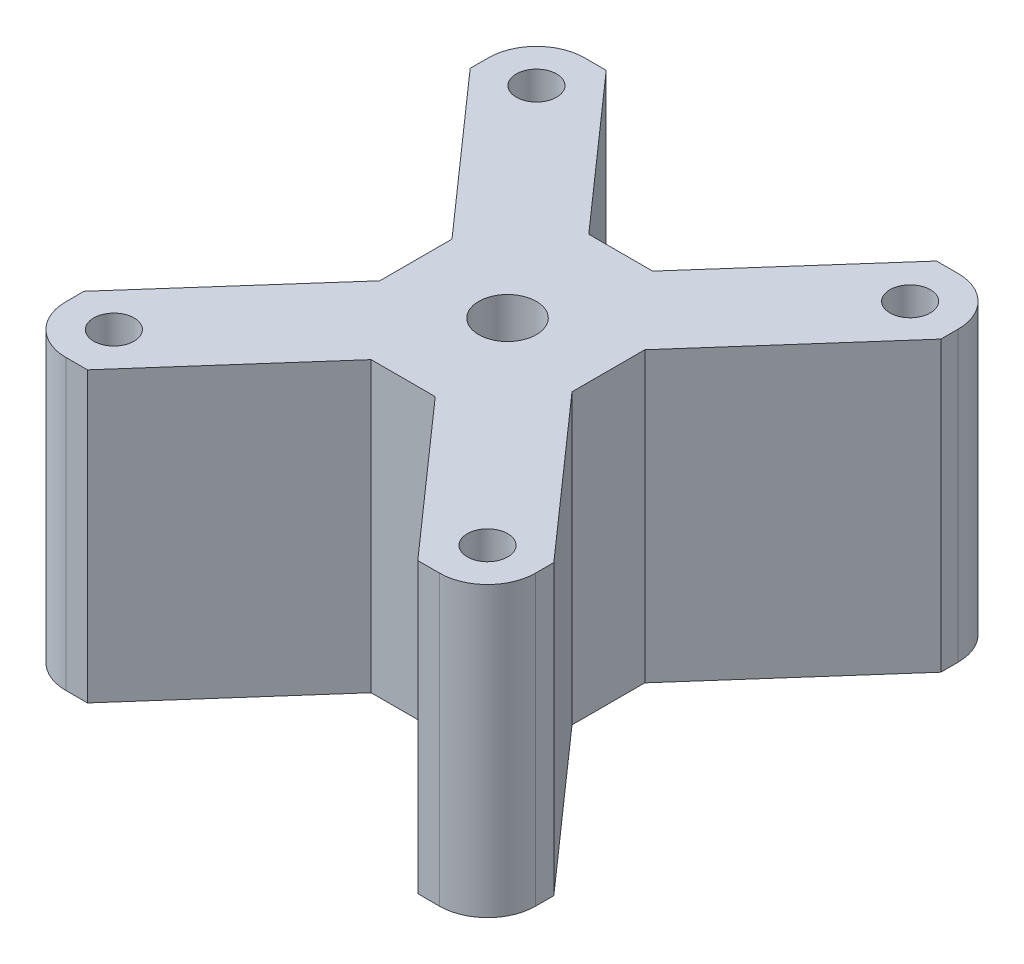
ISO-10303-21;
HEADER;
FILE_DESCRIPTION(('STEP AP214'),'2;1');
FILE_NAME('part.step','',(''),(''),'','','');
FILE_SCHEMA(('AUTOMOTIVE_DESIGN { 1 0 10303 214 1 1 1 1 }'));
ENDSEC;
DATA;
#1=APPLICATION_CONTEXT('core data for automotive mechanical design processes');
#2=APPLICATION_PROTOCOL_DEFINITION('international standard','automotive_design',2000,#1);
#3=PRODUCT_CONTEXT('',#1,'mechanical');
#4=PRODUCT('Part','Part','',(#3));
#5=PRODUCT_RELATED_PRODUCT_CATEGORY('part','',(#4));
#6=PRODUCT_DEFINITION_FORMATION('','',#4);
#7=PRODUCT_DEFINITION_CONTEXT('part definition',#1,'design');
#8=PRODUCT_DEFINITION('design','',#6,#7);
#9=PRODUCT_DEFINITION_SHAPE('','',#8);
#10=(LENGTH_UNIT() NAMED_UNIT(*) SI_UNIT(.MILLI.,.METRE.));
#11=(NAMED_UNIT(*) PLANE_ANGLE_UNIT() SI_UNIT($,.RADIAN.));
#12=(NAMED_UNIT(*) SI_UNIT($,.STERADIAN.) SOLID_ANGLE_UNIT());
#13=UNCERTAINTY_MEASURE_WITH_UNIT(LENGTH_MEASURE(1.E-05),#10,'distance_accuracy_value','');
#14=(GEOMETRIC_REPRESENTATION_CONTEXT(3) GLOBAL_UNCERTAINTY_ASSIGNED_CONTEXT((#13)) GLOBAL_UNIT_ASSIGNED_CONTEXT((#10,
#11,#12)) REPRESENTATION_CONTEXT('',''));
#15=CARTESIAN_POINT('',(0.,0.,0.));
#16=DIRECTION('',(0.,0.,1.));
#17=DIRECTION('',(1.,0.,0.));
#18=AXIS2_PLACEMENT_3D('',#15,#16,#17);
#19=CARTESIAN_POINT('',(9.71399999999135,15.,-11.2189999999902));
#20=DIRECTION('',(0.,1.,0.));
#21=DIRECTION('',(0.,0.,1.));
#22=AXIS2_PLACEMENT_3D('',#19,#20,#21);
#23=PLANE('',#22);
#24=CARTESIAN_POINT('',(-9.71400000000001,15.,-11.2189999999902));
#25=DIRECTION('',(0.,1.,0.));
#26=DIRECTION('',(0.,0.,1.));
#27=AXIS2_PLACEMENT_3D('',#24,#25,#26);
#28=CIRCLE('',#27,1.05000000000286);
#29=CARTESIAN_POINT('',(-9.71400000000001,15.,-10.1689999999874));
#30=VERTEX_POINT('',#29);
#31=EDGE_CURVE('E911',#30,#30,#28,.T.);
#32=ORIENTED_EDGE('',*,*,#31,.F.);
#33=EDGE_LOOP('',(#32));
#34=FACE_BOUND('',#33,.T.);
#35=CARTESIAN_POINT('',(9.71399999999136,15.,10.753));
#36=DIRECTION('',(0.,1.,0.));
#37=DIRECTION('',(0.,0.,1.));
#38=AXIS2_PLACEMENT_3D('',#35,#36,#37);
#39=CIRCLE('',#38,1.05000000000826);
#40=CARTESIAN_POINT('',(9.71399999999136,15.,11.8030000000083));
#41=VERTEX_POINT('',#40);
#42=EDGE_CURVE('E927',#41,#41,#39,.T.);
#43=ORIENTED_EDGE('',*,*,#42,.F.);
#44=EDGE_LOOP('',(#43));
#45=FACE_BOUND('',#44,.T.);
#46=DIRECTION('',(0.,0.,-1.));
#47=VECTOR('',#46,1.);
#48=CARTESIAN_POINT('',(12.2139999999914,15.,-10.3175301047436));
#49=LINE('',#48,#47);
#50=CARTESIAN_POINT('',(12.2139999999914,15.,-10.3175301047436));
#51=VERTEX_POINT('',#50);
#52=CARTESIAN_POINT('',(12.2139999999914,15.,-11.2189999999902));
#53=VERTEX_POINT('',#52);
#54=EDGE_CURVE('E695',#51,#53,#49,.T.);
#55=ORIENTED_EDGE('',*,*,#54,.T.);
#56=CARTESIAN_POINT('',(9.71399999999135,15.,-11.2189999999902));
#57=DIRECTION('',(0.,1.,0.));
#58=DIRECTION('',(0.,0.,1.));
#59=AXIS2_PLACEMENT_3D('',#56,#57,#58);
#60=CIRCLE('',#59,2.5);
#61=CARTESIAN_POINT('',(9.71399999999135,15.,-13.7189999999902));
#62=VERTEX_POINT('',#61);
#63=EDGE_CURVE('E519',#53,#62,#60,.T.);
#64=ORIENTED_EDGE('',*,*,#63,.T.);
#65=DIRECTION('',(1.,0.,0.));
#66=VECTOR('',#65,1.);
#67=CARTESIAN_POINT('',(8.58740267237636,15.,-13.7189999999902));
#68=LINE('',#67,#66);
#69=CARTESIAN_POINT('',(8.58740267237636,15.,-13.7189999999902));
#70=VERTEX_POINT('',#69);
#71=EDGE_CURVE('E768',#70,#62,#68,.T.);
#72=ORIENTED_EDGE('',*,*,#71,.F.);
#73=DIRECTION('',(0.662406133013744,0.,-0.749144922525527));
#74=VECTOR('',#73,1.);
#75=CARTESIAN_POINT('',(1.66039255022599,15.,-5.88493234472561));
#76=LINE('',#75,#74);
#77=CARTESIAN_POINT('',(1.66039255022599,15.,-5.88493234472561));
#78=VERTEX_POINT('',#77);
#79=EDGE_CURVE('E781',#78,#70,#76,.T.);
#80=ORIENTED_EDGE('',*,*,#79,.F.);
#81=DIRECTION('',(1.,0.,0.));
#82=VECTOR('',#81,1.);
#83=CARTESIAN_POINT('',(-1.66039255048656,15.,-5.88493234472561));
#84=LINE('',#83,#82);
#85=CARTESIAN_POINT('',(-1.66039255048656,15.,-5.88493234472561));
#86=VERTEX_POINT('',#85);
#87=EDGE_CURVE('E788',#86,#78,#84,.T.);
#88=ORIENTED_EDGE('',*,*,#87,.F.);
#89=DIRECTION('',(0.662406133020814,0.,0.749144922519276));
#90=VECTOR('',#89,1.);
#91=CARTESIAN_POINT('',(-8.58740267276866,15.,-13.7189999999902));
#92=LINE('',#91,#90);
#93=CARTESIAN_POINT('',(-8.58740267276866,15.,-13.7189999999902));
#94=VERTEX_POINT('',#93);
#95=EDGE_CURVE('E795',#94,#86,#92,.T.);
#96=ORIENTED_EDGE('',*,*,#95,.F.);
#97=DIRECTION('',(1.,0.,0.));
#98=VECTOR('',#97,1.);
#99=CARTESIAN_POINT('',(-9.714,15.,-13.7189999999902));
#100=LINE('',#99,#98);
#101=CARTESIAN_POINT('',(-9.714,15.,-13.7189999999902));
#102=VERTEX_POINT('',#101);
#103=EDGE_CURVE('E799',#102,#94,#100,.T.);
#104=ORIENTED_EDGE('',*,*,#103,.F.);
#105=CARTESIAN_POINT('',(-9.71400000000001,15.,-11.2189999999902));
#106=DIRECTION('',(0.,-1.,0.));
#107=DIRECTION('',(0.,0.,-1.));
#108=AXIS2_PLACEMENT_3D('',#105,#106,#107);
#109=CIRCLE('',#108,2.5);
#110=CARTESIAN_POINT('',(-12.214,15.,-11.2189999999902));
#111=VERTEX_POINT('',#110);
#112=EDGE_CURVE('E803',#111,#102,#109,.T.);
#113=ORIENTED_EDGE('',*,*,#112,.F.);
#114=DIRECTION('',(0.,0.,-1.));
#115=VECTOR('',#114,1.);
#116=CARTESIAN_POINT('',(-12.214,15.,-10.2722429239179));
#117=LINE('',#116,#115);
#118=CARTESIAN_POINT('',(-12.214,15.,-10.2722429239179));
#119=VERTEX_POINT('',#118);
#120=EDGE_CURVE('E807',#119,#111,#117,.T.);
#121=ORIENTED_EDGE('',*,*,#120,.F.);
#122=DIRECTION('',(-0.662406133019342,0.,-0.749144922520578));
#123=VECTOR('',#122,1.);
#124=CARTESIAN_POINT('',(-4.99753056588017,15.,-2.11081269914983));
#125=LINE('',#124,#123);
#126=CARTESIAN_POINT('',(-4.99753056588017,15.,-2.11081269914983));
#127=VERTEX_POINT('',#126);
#128=EDGE_CURVE('E811',#127,#119,#125,.T.);
#129=ORIENTED_EDGE('',*,*,#128,.F.);
#130=DIRECTION('',(0.,0.,1.));
#131=VECTOR('',#130,1.);
#132=CARTESIAN_POINT('',(-4.99753056588017,15.,-2.11081269914983));
#133=LINE('',#132,#131);
#134=CARTESIAN_POINT('',(-4.99753056588017,15.,1.64481269900391));
#135=VERTEX_POINT('',#134);
#136=EDGE_CURVE('E815',#127,#135,#133,.T.);
#137=ORIENTED_EDGE('',*,*,#136,.T.);
#138=DIRECTION('',(-0.662406133013744,0.,0.749144922525527));
#139=VECTOR('',#138,1.);
#140=CARTESIAN_POINT('',(-4.99753056588017,15.,1.64481269900391));
#141=LINE('',#140,#139);
#142=CARTESIAN_POINT('',(-12.214,15.,9.8062429238949));
#143=VERTEX_POINT('',#142);
#144=EDGE_CURVE('E818',#135,#143,#141,.T.);
#145=ORIENTED_EDGE('',*,*,#144,.T.);
#146=DIRECTION('',(0.,0.,-1.));
#147=VECTOR('',#146,1.);
#148=CARTESIAN_POINT('',(-12.214,15.,10.753));
#149=LINE('',#148,#147);
#150=CARTESIAN_POINT('',(-12.214,15.,10.753));
#151=VERTEX_POINT('',#150);
#152=EDGE_CURVE('E821',#151,#143,#149,.T.);
#153=ORIENTED_EDGE('',*,*,#152,.F.);
#154=CARTESIAN_POINT('',(-9.714,15.,10.753));
#155=DIRECTION('',(0.,-1.,0.));
#156=DIRECTION('',(0.,0.,-1.));
#157=AXIS2_PLACEMENT_3D('',#154,#155,#156);
#158=CIRCLE('',#157,2.5);
#159=CARTESIAN_POINT('',(-9.714,15.,13.253));
#160=VERTEX_POINT('',#159);
#161=EDGE_CURVE('E825',#160,#151,#158,.T.);
#162=ORIENTED_EDGE('',*,*,#161,.F.);
#163=DIRECTION('',(1.,0.,0.));
#164=VECTOR('',#163,1.);
#165=CARTESIAN_POINT('',(-9.714,15.,13.253));
#166=LINE('',#165,#164);
#167=CARTESIAN_POINT('',(-8.5859138969199,15.,13.253));
#168=VERTEX_POINT('',#167);
#169=EDGE_CURVE('E829',#160,#168,#166,.T.);
#170=ORIENTED_EDGE('',*,*,#169,.T.);
#171=DIRECTION('',(0.661664335640827,0.,-0.749800178008103));
#172=VECTOR('',#171,1.);
#173=CARTESIAN_POINT('',(-8.5859138969199,15.,13.253));
#174=LINE('',#173,#172);
#175=CARTESIAN_POINT('',(-1.6727077887854,15.,5.4189323447354));
#176=VERTEX_POINT('',#175);
#177=EDGE_CURVE('E832',#168,#176,#174,.T.);
#178=ORIENTED_EDGE('',*,*,#177,.T.);
#179=DIRECTION('',(1.,0.,0.));
#180=VECTOR('',#179,1.);
#181=CARTESIAN_POINT('',(-1.6727077887854,15.,5.4189323447354));
#182=LINE('',#181,#180);
#183=CARTESIAN_POINT('',(1.66039255046393,15.,5.4189323447354));
#184=VERTEX_POINT('',#183);
#185=EDGE_CURVE('E835',#176,#184,#182,.T.);
#186=ORIENTED_EDGE('',*,*,#185,.T.);
#187=DIRECTION('',(0.662406133019342,0.,0.749144922520577));
#188=VECTOR('',#187,1.);
#189=CARTESIAN_POINT('',(1.66039255046393,15.,5.4189323447354));
#190=LINE('',#189,#188);
#191=CARTESIAN_POINT('',(8.5874026727186,15.,13.253));
#192=VERTEX_POINT('',#191);
#193=EDGE_CURVE('E838',#184,#192,#190,.T.);
#194=ORIENTED_EDGE('',*,*,#193,.T.);
#195=DIRECTION('',(1.,0.,0.));
#196=VECTOR('',#195,1.);
#197=CARTESIAN_POINT('',(8.5874026727186,15.,13.253));
#198=LINE('',#197,#196);
#199=CARTESIAN_POINT('',(9.71399999999136,15.,13.253));
#200=VERTEX_POINT('',#199);
#201=EDGE_CURVE('E841',#192,#200,#198,.T.);
#202=ORIENTED_EDGE('',*,*,#201,.T.);
#203=CARTESIAN_POINT('',(9.71399999999136,15.,10.753));
#204=DIRECTION('',(0.,1.,0.));
#205=DIRECTION('',(0.,0.,1.));
#206=AXIS2_PLACEMENT_3D('',#203,#204,#205);
#207=CIRCLE('',#206,2.5);
#208=CARTESIAN_POINT('',(12.2139999999914,15.,10.753));
#209=VERTEX_POINT('',#208);
#210=EDGE_CURVE('E844',#200,#209,#207,.T.);
#211=ORIENTED_EDGE('',*,*,#210,.T.);
#212=DIRECTION('',(0.,0.,-1.));
#213=VECTOR('',#212,1.);
#214=CARTESIAN_POINT('',(12.2139999999914,15.,10.753));
#215=LINE('',#214,#213);
#216=CARTESIAN_POINT('',(12.2139999999914,15.,9.80624292388141));
#217=VERTEX_POINT('',#216);
#218=EDGE_CURVE('E598',#209,#217,#215,.T.);
#219=ORIENTED_EDGE('',*,*,#218,.T.);
#220=DIRECTION('',(0.662406133020814,0.,0.749144922519276));
#221=VECTOR('',#220,1.);
#222=CARTESIAN_POINT('',(4.99753056587153,15.,1.64481269914562));
#223=LINE('',#222,#221);
#224=CARTESIAN_POINT('',(4.99753056587153,15.,1.64481269914562));
#225=VERTEX_POINT('',#224);
#226=EDGE_CURVE('E585',#225,#217,#223,.T.);
#227=ORIENTED_EDGE('',*,*,#226,.F.);
#228=DIRECTION('',(0.,0.,1.));
#229=VECTOR('',#228,1.);
#230=CARTESIAN_POINT('',(4.99753056587153,15.,-2.13980346174328));
#231=LINE('',#230,#229);
#232=CARTESIAN_POINT('',(4.99753056587153,15.,-2.13980346174328));
#233=VERTEX_POINT('',#232);
#234=EDGE_CURVE('E596',#233,#225,#231,.T.);
#235=ORIENTED_EDGE('',*,*,#234,.F.);
#236=DIRECTION('',(0.661664335640827,0.,-0.749800178008103));
#237=VECTOR('',#236,1.);
#238=CARTESIAN_POINT('',(4.99753056587153,15.,-2.13980346174328));
#239=LINE('',#238,#237);
#240=EDGE_CURVE('E432',#233,#51,#239,.T.);
#241=ORIENTED_EDGE('',*,*,#240,.T.);
#242=EDGE_LOOP('',(#55,#64,#72,#80,#88,#96,#104,#113,#121,#129,#137,#145,#153,#162,#170,#178,
#186,#194,#202,#211,#219,#227,#235,#241));
#243=FACE_BOUND('',#242,.T.);
#244=CARTESIAN_POINT('',(9.71399999999135,15.,-11.2189999999902));
#245=DIRECTION('',(0.,1.,0.));
#246=DIRECTION('',(0.,0.,1.));
#247=AXIS2_PLACEMENT_3D('',#244,#245,#246);
#248=CIRCLE('',#247,1.05000000001113);
#249=CARTESIAN_POINT('',(9.71399999999135,15.,-10.1689999999791));
#250=VERTEX_POINT('',#249);
#251=EDGE_CURVE('E615',#250,#250,#248,.T.);
#252=ORIENTED_EDGE('',*,*,#251,.F.);
#253=EDGE_LOOP('',(#252));
#254=FACE_BOUND('',#253,.T.);
#255=CARTESIAN_POINT('',(-9.714,15.,10.753));
#256=DIRECTION('',(0.,1.,0.));
#257=DIRECTION('',(0.,0.,1.));
#258=AXIS2_PLACEMENT_3D('',#255,#256,#257);
#259=CIRCLE('',#258,1.05);
#260=CARTESIAN_POINT('',(-9.714,15.,11.803));
#261=VERTEX_POINT('',#260);
#262=EDGE_CURVE('E919',#261,#261,#259,.T.);
#263=ORIENTED_EDGE('',*,*,#262,.F.);
#264=EDGE_LOOP('',(#263));
#265=FACE_BOUND('',#264,.T.);
#266=CARTESIAN_POINT('',(0.,15.,0.));
#267=DIRECTION('',(0.,1.,0.));
#268=DIRECTION('',(0.,0.,1.));
#269=AXIS2_PLACEMENT_3D('',#266,#267,#268);
#270=CIRCLE('',#269,1.5);
#271=CARTESIAN_POINT('',(0.,15.,1.5));
#272=VERTEX_POINT('',#271);
#273=EDGE_CURVE('E900',#272,#272,#270,.T.);
#274=ORIENTED_EDGE('',*,*,#273,.F.);
#275=EDGE_LOOP('',(#274));
#276=FACE_BOUND('',#275,.T.);
#277=ADVANCED_FACE('F414',(#34,#45,#243,#254,#265,#276),#23,.T.);
#278=CARTESIAN_POINT('',(9.71399999999135,0.,-11.2189999999902));
#279=DIRECTION('',(0.,1.,0.));
#280=DIRECTION('',(0.,0.,1.));
#281=AXIS2_PLACEMENT_3D('',#278,#279,#280);
#282=PLANE('',#281);
#283=DIRECTION('',(0.,0.,-1.));
#284=VECTOR('',#283,1.);
#285=CARTESIAN_POINT('',(12.2139999999914,0.,-10.3175301047436));
#286=LINE('',#285,#284);
#287=CARTESIAN_POINT('',(12.2139999999914,0.,-10.3175301047436));
#288=VERTEX_POINT('',#287);
#289=CARTESIAN_POINT('',(12.2139999999914,0.,-11.2189999999902));
#290=VERTEX_POINT('',#289);
#291=EDGE_CURVE('E610',#288,#290,#286,.T.);
#292=ORIENTED_EDGE('',*,*,#291,.F.);
#293=DIRECTION('',(0.661664335640827,0.,-0.749800178008103));
#294=VECTOR('',#293,1.);
#295=CARTESIAN_POINT('',(4.99753056587153,0.,-2.13980346174328));
#296=LINE('',#295,#294);
#297=CARTESIAN_POINT('',(4.99753056587153,0.,-2.13980346174328));
#298=VERTEX_POINT('',#297);
#299=EDGE_CURVE('E511',#298,#288,#296,.T.);
#300=ORIENTED_EDGE('',*,*,#299,.F.);
#301=DIRECTION('',(0.,0.,1.));
#302=VECTOR('',#301,1.);
#303=CARTESIAN_POINT('',(4.99753056587153,0.,-2.13980346174328));
#304=LINE('',#303,#302);
#305=CARTESIAN_POINT('',(4.99753056587153,0.,1.64481269914562));
#306=VERTEX_POINT('',#305);
#307=EDGE_CURVE('E690',#298,#306,#304,.T.);
#308=ORIENTED_EDGE('',*,*,#307,.T.);
#309=DIRECTION('',(0.662406133020814,0.,0.749144922519276));
#310=VECTOR('',#309,1.);
#311=CARTESIAN_POINT('',(4.99753056587153,0.,1.64481269914562));
#312=LINE('',#311,#310);
#313=CARTESIAN_POINT('',(12.2139999999914,0.,9.80624292388141));
#314=VERTEX_POINT('',#313);
#315=EDGE_CURVE('E587',#306,#314,#312,.T.);
#316=ORIENTED_EDGE('',*,*,#315,.T.);
#317=DIRECTION('',(0.,0.,-1.));
#318=VECTOR('',#317,1.);
#319=CARTESIAN_POINT('',(12.2139999999914,0.,10.753));
#320=LINE('',#319,#318);
#321=CARTESIAN_POINT('',(12.2139999999914,0.,10.753));
#322=VERTEX_POINT('',#321);
#323=EDGE_CURVE('E684',#322,#314,#320,.T.);
#324=ORIENTED_EDGE('',*,*,#323,.F.);
#325=CARTESIAN_POINT('',(9.71399999999136,0.,10.753));
#326=DIRECTION('',(0.,1.,0.));
#327=DIRECTION('',(0.,0.,1.));
#328=AXIS2_PLACEMENT_3D('',#325,#326,#327);
#329=CIRCLE('',#328,2.5);
#330=CARTESIAN_POINT('',(9.71399999999136,0.,13.253));
#331=VERTEX_POINT('',#330);
#332=EDGE_CURVE('E681',#331,#322,#329,.T.);
#333=ORIENTED_EDGE('',*,*,#332,.F.);
#334=DIRECTION('',(1.,0.,0.));
#335=VECTOR('',#334,1.);
#336=CARTESIAN_POINT('',(8.5874026727186,0.,13.253));
#337=LINE('',#336,#335);
#338=CARTESIAN_POINT('',(8.5874026727186,0.,13.253));
#339=VERTEX_POINT('',#338);
#340=EDGE_CURVE('E678',#339,#331,#337,.T.);
#341=ORIENTED_EDGE('',*,*,#340,.F.);
#342=DIRECTION('',(0.662406133019342,0.,0.749144922520577));
#343=VECTOR('',#342,1.);
#344=CARTESIAN_POINT('',(1.66039255046393,0.,5.4189323447354));
#345=LINE('',#344,#343);
#346=CARTESIAN_POINT('',(1.66039255046393,0.,5.4189323447354));
#347=VERTEX_POINT('',#346);
#348=EDGE_CURVE('E675',#347,#339,#345,.T.);
#349=ORIENTED_EDGE('',*,*,#348,.F.);
#350=DIRECTION('',(1.,0.,0.));
#351=VECTOR('',#350,1.);
#352=CARTESIAN_POINT('',(-1.6727077887854,0.,5.4189323447354));
#353=LINE('',#352,#351);
#354=CARTESIAN_POINT('',(-1.6727077887854,0.,5.4189323447354));
#355=VERTEX_POINT('',#354);
#356=EDGE_CURVE('E672',#355,#347,#353,.T.);
#357=ORIENTED_EDGE('',*,*,#356,.F.);
#358=DIRECTION('',(0.661664335640827,0.,-0.749800178008103));
#359=VECTOR('',#358,1.);
#360=CARTESIAN_POINT('',(-8.5859138969199,0.,13.253));
#361=LINE('',#360,#359);
#362=CARTESIAN_POINT('',(-8.5859138969199,0.,13.253));
#363=VERTEX_POINT('',#362);
#364=EDGE_CURVE('E669',#363,#355,#361,.T.);
#365=ORIENTED_EDGE('',*,*,#364,.F.);
#366=DIRECTION('',(1.,0.,0.));
#367=VECTOR('',#366,1.);
#368=CARTESIAN_POINT('',(-9.714,0.,13.253));
#369=LINE('',#368,#367);
#370=CARTESIAN_POINT('',(-9.714,0.,13.253));
#371=VERTEX_POINT('',#370);
#372=EDGE_CURVE('E666',#371,#363,#369,.T.);
#373=ORIENTED_EDGE('',*,*,#372,.F.);
#374=CARTESIAN_POINT('',(-9.714,0.,10.753));
#375=DIRECTION('',(0.,-1.,0.));
#376=DIRECTION('',(0.,0.,-1.));
#377=AXIS2_PLACEMENT_3D('',#374,#375,#376);
#378=CIRCLE('',#377,2.5);
#379=CARTESIAN_POINT('',(-12.214,0.,10.753));
#380=VERTEX_POINT('',#379);
#381=EDGE_CURVE('E662',#371,#380,#378,.T.);
#382=ORIENTED_EDGE('',*,*,#381,.T.);
#383=DIRECTION('',(0.,0.,-1.));
#384=VECTOR('',#383,1.);
#385=CARTESIAN_POINT('',(-12.214,0.,10.753));
#386=LINE('',#385,#384);
#387=CARTESIAN_POINT('',(-12.214,0.,9.8062429238949));
#388=VERTEX_POINT('',#387);
#389=EDGE_CURVE('E658',#380,#388,#386,.T.);
#390=ORIENTED_EDGE('',*,*,#389,.T.);
#391=DIRECTION('',(-0.662406133013744,0.,0.749144922525527));
#392=VECTOR('',#391,1.);
#393=CARTESIAN_POINT('',(-4.99753056588017,0.,1.64481269900391));
#394=LINE('',#393,#392);
#395=CARTESIAN_POINT('',(-4.99753056588017,0.,1.64481269900391));
#396=VERTEX_POINT('',#395);
#397=EDGE_CURVE('E654',#396,#388,#394,.T.);
#398=ORIENTED_EDGE('',*,*,#397,.F.);
#399=DIRECTION('',(0.,0.,1.));
#400=VECTOR('',#399,1.);
#401=CARTESIAN_POINT('',(-4.99753056588017,0.,-2.11081269914983));
#402=LINE('',#401,#400);
#403=CARTESIAN_POINT('',(-4.99753056588017,0.,-2.11081269914983));
#404=VERTEX_POINT('',#403);
#405=EDGE_CURVE('E651',#404,#396,#402,.T.);
#406=ORIENTED_EDGE('',*,*,#405,.F.);
#407=DIRECTION('',(-0.662406133019342,0.,-0.749144922520578));
#408=VECTOR('',#407,1.);
#409=CARTESIAN_POINT('',(-4.99753056588017,0.,-2.11081269914983));
#410=LINE('',#409,#408);
#411=CARTESIAN_POINT('',(-12.214,0.,-10.2722429239179));
#412=VERTEX_POINT('',#411);
#413=EDGE_CURVE('E647',#404,#412,#410,.T.);
#414=ORIENTED_EDGE('',*,*,#413,.T.);
#415=DIRECTION('',(0.,0.,-1.));
#416=VECTOR('',#415,1.);
#417=CARTESIAN_POINT('',(-12.214,0.,-10.2722429239179));
#418=LINE('',#417,#416);
#419=CARTESIAN_POINT('',(-12.214,0.,-11.2189999999902));
#420=VERTEX_POINT('',#419);
#421=EDGE_CURVE('E643',#412,#420,#418,.T.);
#422=ORIENTED_EDGE('',*,*,#421,.T.);
#423=CARTESIAN_POINT('',(-9.71400000000001,0.,-11.2189999999902));
#424=DIRECTION('',(0.,-1.,0.));
#425=DIRECTION('',(0.,0.,-1.));
#426=AXIS2_PLACEMENT_3D('',#423,#424,#425);
#427=CIRCLE('',#426,2.5);
#428=CARTESIAN_POINT('',(-9.714,0.,-13.7189999999902));
#429=VERTEX_POINT('',#428);
#430=EDGE_CURVE('E639',#420,#429,#427,.T.);
#431=ORIENTED_EDGE('',*,*,#430,.T.);
#432=DIRECTION('',(1.,0.,0.));
#433=VECTOR('',#432,1.);
#434=CARTESIAN_POINT('',(-9.714,0.,-13.7189999999902));
#435=LINE('',#434,#433);
#436=CARTESIAN_POINT('',(-8.58740267276866,0.,-13.7189999999902));
#437=VERTEX_POINT('',#436);
#438=EDGE_CURVE('E635',#429,#437,#435,.T.);
#439=ORIENTED_EDGE('',*,*,#438,.T.);
#440=DIRECTION('',(0.662406133020814,0.,0.749144922519276));
#441=VECTOR('',#440,1.);
#442=CARTESIAN_POINT('',(-8.58740267276866,0.,-13.7189999999902));
#443=LINE('',#442,#441);
#444=CARTESIAN_POINT('',(-1.66039255048656,0.,-5.88493234472561));
#445=VERTEX_POINT('',#444);
#446=EDGE_CURVE('E631',#437,#445,#443,.T.);
#447=ORIENTED_EDGE('',*,*,#446,.T.);
#448=DIRECTION('',(1.,0.,0.));
#449=VECTOR('',#448,1.);
#450=CARTESIAN_POINT('',(-1.66039255048656,0.,-5.88493234472561));
#451=LINE('',#450,#449);
#452=CARTESIAN_POINT('',(1.66039255022599,0.,-5.88493234472561));
#453=VERTEX_POINT('',#452);
#454=EDGE_CURVE('E627',#445,#453,#451,.T.);
#455=ORIENTED_EDGE('',*,*,#454,.T.);
#456=DIRECTION('',(0.662406133013744,0.,-0.749144922525527));
#457=VECTOR('',#456,1.);
#458=CARTESIAN_POINT('',(1.66039255022599,0.,-5.88493234472561));
#459=LINE('',#458,#457);
#460=CARTESIAN_POINT('',(8.58740267237636,0.,-13.7189999999902));
#461=VERTEX_POINT('',#460);
#462=EDGE_CURVE('E623',#453,#461,#459,.T.);
#463=ORIENTED_EDGE('',*,*,#462,.T.);
#464=DIRECTION('',(1.,0.,0.));
#465=VECTOR('',#464,1.);
#466=CARTESIAN_POINT('',(8.58740267237636,0.,-13.7189999999902));
#467=LINE('',#466,#465);
#468=CARTESIAN_POINT('',(9.71399999999135,0.,-13.7189999999902));
#469=VERTEX_POINT('',#468);
#470=EDGE_CURVE('E619',#461,#469,#467,.T.);
#471=ORIENTED_EDGE('',*,*,#470,.T.);
#472=CARTESIAN_POINT('',(9.71399999999135,0.,-11.2189999999902));
#473=DIRECTION('',(0.,1.,0.));
#474=DIRECTION('',(0.,0.,1.));
#475=AXIS2_PLACEMENT_3D('',#472,#473,#474);
#476=CIRCLE('',#475,2.5);
#477=EDGE_CURVE('E614',#290,#469,#476,.T.);
#478=ORIENTED_EDGE('',*,*,#477,.F.);
#479=EDGE_LOOP('',(#292,#300,#308,#316,#324,#333,#341,#349,#357,#365,#373,#382,#390,#398,#406,
#414,#422,#431,#439,#447,#455,#463,#471,#478));
#480=FACE_BOUND('',#479,.T.);
#481=CARTESIAN_POINT('',(9.71399999999135,0.,-11.2189999999902));
#482=DIRECTION('',(0.,1.,0.));
#483=DIRECTION('',(0.,0.,1.));
#484=AXIS2_PLACEMENT_3D('',#481,#482,#483);
#485=CIRCLE('',#484,1.05000000001113);
#486=CARTESIAN_POINT('',(9.71399999999135,0.,-10.1689999999791));
#487=VERTEX_POINT('',#486);
#488=EDGE_CURVE('E931',#487,#487,#485,.T.);
#489=ORIENTED_EDGE('',*,*,#488,.T.);
#490=EDGE_LOOP('',(#489));
#491=FACE_BOUND('',#490,.T.);
#492=CARTESIAN_POINT('',(9.71399999999136,0.,10.753));
#493=DIRECTION('',(0.,1.,0.));
#494=DIRECTION('',(0.,0.,1.));
#495=AXIS2_PLACEMENT_3D('',#492,#493,#494);
#496=CIRCLE('',#495,1.05000000000826);
#497=CARTESIAN_POINT('',(9.71399999999136,0.,11.8030000000083));
#498=VERTEX_POINT('',#497);
#499=EDGE_CURVE('E923',#498,#498,#496,.T.);
#500=ORIENTED_EDGE('',*,*,#499,.T.);
#501=EDGE_LOOP('',(#500));
#502=FACE_BOUND('',#501,.T.);
#503=CARTESIAN_POINT('',(-9.714,0.,10.753));
#504=DIRECTION('',(0.,1.,0.));
#505=DIRECTION('',(0.,0.,1.));
#506=AXIS2_PLACEMENT_3D('',#503,#504,#505);
#507=CIRCLE('',#506,1.05);
#508=CARTESIAN_POINT('',(-9.714,0.,11.803));
#509=VERTEX_POINT('',#508);
#510=EDGE_CURVE('E915',#509,#509,#507,.T.);
#511=ORIENTED_EDGE('',*,*,#510,.T.);
#512=EDGE_LOOP('',(#511));
#513=FACE_BOUND('',#512,.T.);
#514=CARTESIAN_POINT('',(-9.71400000000001,0.,-11.2189999999902));
#515=DIRECTION('',(0.,1.,0.));
#516=DIRECTION('',(0.,0.,1.));
#517=AXIS2_PLACEMENT_3D('',#514,#515,#516);
#518=CIRCLE('',#517,1.05000000000286);
#519=CARTESIAN_POINT('',(-9.71400000000001,0.,-10.1689999999874));
#520=VERTEX_POINT('',#519);
#521=EDGE_CURVE('E908',#520,#520,#518,.T.);
#522=ORIENTED_EDGE('',*,*,#521,.T.);
#523=EDGE_LOOP('',(#522));
#524=FACE_BOUND('',#523,.T.);
#525=CARTESIAN_POINT('',(0.,0.,0.));
#526=DIRECTION('',(0.,1.,0.));
#527=DIRECTION('',(0.,0.,1.));
#528=AXIS2_PLACEMENT_3D('',#525,#526,#527);
#529=CIRCLE('',#528,1.5);
#530=CARTESIAN_POINT('',(0.,0.,1.5));
#531=VERTEX_POINT('',#530);
#532=EDGE_CURVE('E903',#531,#531,#529,.T.);
#533=ORIENTED_EDGE('',*,*,#532,.T.);
#534=EDGE_LOOP('',(#533));
#535=FACE_BOUND('',#534,.T.);
#536=ADVANCED_FACE('F773',(#480,#491,#502,#513,#524,#535),#282,.F.);
#537=CARTESIAN_POINT('',(12.2139999999914,15.,-10.3175301047436));
#538=DIRECTION('',(-1.,0.,0.));
#539=DIRECTION('',(0.,0.,1.));
#540=AXIS2_PLACEMENT_3D('',#537,#538,#539);
#541=PLANE('',#540);
#542=ORIENTED_EDGE('',*,*,#291,.T.);
#543=DIRECTION('',(0.,-1.,0.));
#544=VECTOR('',#543,1.);
#545=CARTESIAN_POINT('',(12.2139999999914,15.,-11.2189999999902));
#546=LINE('',#545,#544);
#547=EDGE_CURVE('E12',#53,#290,#546,.T.);
#548=ORIENTED_EDGE('',*,*,#547,.F.);
#549=ORIENTED_EDGE('',*,*,#54,.F.);
#550=DIRECTION('',(0.,-1.,0.));
#551=VECTOR('',#550,1.);
#552=CARTESIAN_POINT('',(12.2139999999914,15.,-10.3175301047436));
#553=LINE('',#552,#551);
#554=EDGE_CURVE('E606',#51,#288,#553,.T.);
#555=ORIENTED_EDGE('',*,*,#554,.T.);
#556=EDGE_LOOP('',(#542,#548,#549,#555));
#557=FACE_BOUND('',#556,.T.);
#558=ADVANCED_FACE('F416',(#557),#541,.F.);
#559=CARTESIAN_POINT('',(9.71399999999135,15.,-11.2189999999902));
#560=DIRECTION('',(0.,-1.,0.));
#561=DIRECTION('',(0.,0.,-1.));
#562=AXIS2_PLACEMENT_3D('',#559,#560,#561);
#563=CYLINDRICAL_SURFACE('',#562,2.5);
#564=ORIENTED_EDGE('',*,*,#477,.T.);
#565=DIRECTION('',(0.,-1.,0.));
#566=VECTOR('',#565,1.);
#567=CARTESIAN_POINT('',(9.71399999999135,15.,-13.7189999999902));
#568=LINE('',#567,#566);
#569=EDGE_CURVE('E424',#62,#469,#568,.T.);
#570=ORIENTED_EDGE('',*,*,#569,.F.);
#571=ORIENTED_EDGE('',*,*,#63,.F.);
#572=ORIENTED_EDGE('',*,*,#547,.T.);
#573=EDGE_LOOP('',(#564,#570,#571,#572));
#574=FACE_BOUND('',#573,.T.);
#575=ADVANCED_FACE('F769',(#574),#563,.T.);
#576=CARTESIAN_POINT('',(8.58740267237636,15.,-13.7189999999902));
#577=DIRECTION('',(0.,0.,-1.));
#578=DIRECTION('',(-1.,0.,0.));
#579=AXIS2_PLACEMENT_3D('',#576,#577,#578);
#580=PLANE('',#579);
#581=ORIENTED_EDGE('',*,*,#470,.F.);
#582=DIRECTION('',(0.,-1.,0.));
#583=VECTOR('',#582,1.);
#584=CARTESIAN_POINT('',(8.58740267237636,15.,-13.7189999999902));
#585=LINE('',#584,#583);
#586=EDGE_CURVE('E760',#70,#461,#585,.T.);
#587=ORIENTED_EDGE('',*,*,#586,.F.);
#588=ORIENTED_EDGE('',*,*,#71,.T.);
#589=ORIENTED_EDGE('',*,*,#569,.T.);
#590=EDGE_LOOP('',(#581,#587,#588,#589));
#591=FACE_BOUND('',#590,.T.);
#592=ADVANCED_FACE('F766',(#591),#580,.T.);
#593=CARTESIAN_POINT('',(1.66039255022599,15.,-5.88493234472561));
#594=DIRECTION('',(-0.749144922525527,0.,-0.662406133013744));
#595=DIRECTION('',(-0.662406133013744,0.,0.749144922525527));
#596=AXIS2_PLACEMENT_3D('',#593,#594,#595);
#597=PLANE('',#596);
#598=ORIENTED_EDGE('',*,*,#462,.F.);
#599=DIRECTION('',(0.,-1.,0.));
#600=VECTOR('',#599,1.);
#601=CARTESIAN_POINT('',(1.66039255022599,15.,-5.88493234472561));
#602=LINE('',#601,#600);
#603=EDGE_CURVE('E757',#78,#453,#602,.T.);
#604=ORIENTED_EDGE('',*,*,#603,.F.);
#605=ORIENTED_EDGE('',*,*,#79,.T.);
#606=ORIENTED_EDGE('',*,*,#586,.T.);
#607=EDGE_LOOP('',(#598,#604,#605,#606));
#608=FACE_BOUND('',#607,.T.);
#609=ADVANCED_FACE('F778',(#608),#597,.T.);
#610=CARTESIAN_POINT('',(-1.66039255048656,15.,-5.88493234472561));
#611=DIRECTION('',(0.,0.,-1.));
#612=DIRECTION('',(-1.,0.,0.));
#613=AXIS2_PLACEMENT_3D('',#610,#611,#612);
#614=PLANE('',#613);
#615=ORIENTED_EDGE('',*,*,#454,.F.);
#616=DIRECTION('',(0.,-1.,0.));
#617=VECTOR('',#616,1.);
#618=CARTESIAN_POINT('',(-1.66039255048656,15.,-5.88493234472561));
#619=LINE('',#618,#617);
#620=EDGE_CURVE('E754',#86,#445,#619,.T.);
#621=ORIENTED_EDGE('',*,*,#620,.F.);
#622=ORIENTED_EDGE('',*,*,#87,.T.);
#623=ORIENTED_EDGE('',*,*,#603,.T.);
#624=EDGE_LOOP('',(#615,#621,#622,#623));
#625=FACE_BOUND('',#624,.T.);
#626=ADVANCED_FACE('F1147',(#625),#614,.T.);
#627=CARTESIAN_POINT('',(-8.58740267276866,15.,-13.7189999999902));
#628=DIRECTION('',(0.749144922519276,0.,-0.662406133020814));
#629=DIRECTION('',(-0.662406133020814,0.,-0.749144922519276));
#630=AXIS2_PLACEMENT_3D('',#627,#628,#629);
#631=PLANE('',#630);
#632=ORIENTED_EDGE('',*,*,#446,.F.);
#633=DIRECTION('',(0.,-1.,0.));
#634=VECTOR('',#633,1.);
#635=CARTESIAN_POINT('',(-8.58740267276866,15.,-13.7189999999902));
#636=LINE('',#635,#634);
#637=EDGE_CURVE('E751',#94,#437,#636,.T.);
#638=ORIENTED_EDGE('',*,*,#637,.F.);
#639=ORIENTED_EDGE('',*,*,#95,.T.);
#640=ORIENTED_EDGE('',*,*,#620,.T.);
#641=EDGE_LOOP('',(#632,#638,#639,#640));
#642=FACE_BOUND('',#641,.T.);
#643=ADVANCED_FACE('F1137',(#642),#631,.T.);
#644=CARTESIAN_POINT('',(-9.714,15.,-13.7189999999902));
#645=DIRECTION('',(0.,0.,-1.));
#646=DIRECTION('',(-1.,0.,0.));
#647=AXIS2_PLACEMENT_3D('',#644,#645,#646);
#648=PLANE('',#647);
#649=ORIENTED_EDGE('',*,*,#438,.F.);
#650=DIRECTION('',(0.,-1.,0.));
#651=VECTOR('',#650,1.);
#652=CARTESIAN_POINT('',(-9.714,15.,-13.7189999999902));
#653=LINE('',#652,#651);
#654=EDGE_CURVE('E748',#102,#429,#653,.T.);
#655=ORIENTED_EDGE('',*,*,#654,.F.);
#656=ORIENTED_EDGE('',*,*,#103,.T.);
#657=ORIENTED_EDGE('',*,*,#637,.T.);
#658=EDGE_LOOP('',(#649,#655,#656,#657));
#659=FACE_BOUND('',#658,.T.);
#660=ADVANCED_FACE('F1127',(#659),#648,.T.);
#661=CARTESIAN_POINT('',(-9.71400000000001,15.,-11.2189999999902));
#662=DIRECTION('',(0.,-1.,0.));
#663=DIRECTION('',(0.,0.,-1.));
#664=AXIS2_PLACEMENT_3D('',#661,#662,#663);
#665=CYLINDRICAL_SURFACE('',#664,2.5);
#666=ORIENTED_EDGE('',*,*,#430,.F.);
#667=DIRECTION('',(0.,-1.,0.));
#668=VECTOR('',#667,1.);
#669=CARTESIAN_POINT('',(-12.214,15.,-11.2189999999902));
#670=LINE('',#669,#668);
#671=EDGE_CURVE('E745',#111,#420,#670,.T.);
#672=ORIENTED_EDGE('',*,*,#671,.F.);
#673=ORIENTED_EDGE('',*,*,#112,.T.);
#674=ORIENTED_EDGE('',*,*,#654,.T.);
#675=EDGE_LOOP('',(#666,#672,#673,#674));
#676=FACE_BOUND('',#675,.T.);
#677=ADVANCED_FACE('F1117',(#676),#665,.T.);
#678=CARTESIAN_POINT('',(-12.214,15.,-10.2722429239179));
#679=DIRECTION('',(-1.,0.,0.));
#680=DIRECTION('',(0.,0.,1.));
#681=AXIS2_PLACEMENT_3D('',#678,#679,#680);
#682=PLANE('',#681);
#683=ORIENTED_EDGE('',*,*,#421,.F.);
#684=DIRECTION('',(0.,-1.,0.));
#685=VECTOR('',#684,1.);
#686=CARTESIAN_POINT('',(-12.214,15.,-10.2722429239179));
#687=LINE('',#686,#685);
#688=EDGE_CURVE('E742',#119,#412,#687,.T.);
#689=ORIENTED_EDGE('',*,*,#688,.F.);
#690=ORIENTED_EDGE('',*,*,#120,.T.);
#691=ORIENTED_EDGE('',*,*,#671,.T.);
#692=EDGE_LOOP('',(#683,#689,#690,#691));
#693=FACE_BOUND('',#692,.T.);
#694=ADVANCED_FACE('F1107',(#693),#682,.T.);
#695=CARTESIAN_POINT('',(-4.99753056588017,15.,-2.11081269914983));
#696=DIRECTION('',(-0.749144922520578,0.,0.662406133019342));
#697=DIRECTION('',(0.662406133019342,0.,0.749144922520578));
#698=AXIS2_PLACEMENT_3D('',#695,#696,#697);
#699=PLANE('',#698);
#700=ORIENTED_EDGE('',*,*,#413,.F.);
#701=DIRECTION('',(0.,-1.,0.));
#702=VECTOR('',#701,1.);
#703=CARTESIAN_POINT('',(-4.99753056588017,15.,-2.11081269914983));
#704=LINE('',#703,#702);
#705=EDGE_CURVE('E739',#127,#404,#704,.T.);
#706=ORIENTED_EDGE('',*,*,#705,.F.);
#707=ORIENTED_EDGE('',*,*,#128,.T.);
#708=ORIENTED_EDGE('',*,*,#688,.T.);
#709=EDGE_LOOP('',(#700,#706,#707,#708));
#710=FACE_BOUND('',#709,.T.);
#711=ADVANCED_FACE('F1097',(#710),#699,.T.);
#712=CARTESIAN_POINT('',(-4.99753056588017,15.,-2.11081269914983));
#713=DIRECTION('',(1.,0.,0.));
#714=DIRECTION('',(0.,0.,-1.));
#715=AXIS2_PLACEMENT_3D('',#712,#713,#714);
#716=PLANE('',#715);
#717=ORIENTED_EDGE('',*,*,#405,.T.);
#718=DIRECTION('',(0.,-1.,0.));
#719=VECTOR('',#718,1.);
#720=CARTESIAN_POINT('',(-4.99753056588017,15.,1.64481269900391));
#721=LINE('',#720,#719);
#722=EDGE_CURVE('E735',#135,#396,#721,.T.);
#723=ORIENTED_EDGE('',*,*,#722,.F.);
#724=ORIENTED_EDGE('',*,*,#136,.F.);
#725=ORIENTED_EDGE('',*,*,#705,.T.);
#726=EDGE_LOOP('',(#717,#723,#724,#725));
#727=FACE_BOUND('',#726,.T.);
#728=ADVANCED_FACE('F1087',(#727),#716,.F.);
#729=CARTESIAN_POINT('',(-4.99753056588017,15.,1.64481269900391));
#730=DIRECTION('',(0.749144922525527,0.,0.662406133013744));
#731=DIRECTION('',(0.662406133013744,0.,-0.749144922525527));
#732=AXIS2_PLACEMENT_3D('',#729,#730,#731);
#733=PLANE('',#732);
#734=ORIENTED_EDGE('',*,*,#397,.T.);
#735=DIRECTION('',(0.,-1.,0.));
#736=VECTOR('',#735,1.);
#737=CARTESIAN_POINT('',(-12.214,15.,9.8062429238949));
#738=LINE('',#737,#736);
#739=EDGE_CURVE('E732',#143,#388,#738,.T.);
#740=ORIENTED_EDGE('',*,*,#739,.F.);
#741=ORIENTED_EDGE('',*,*,#144,.F.);
#742=ORIENTED_EDGE('',*,*,#722,.T.);
#743=EDGE_LOOP('',(#734,#740,#741,#742));
#744=FACE_BOUND('',#743,.T.);
#745=ADVANCED_FACE('F1077',(#744),#733,.F.);
#746=CARTESIAN_POINT('',(-12.214,15.,10.753));
#747=DIRECTION('',(-1.,0.,0.));
#748=DIRECTION('',(0.,0.,1.));
#749=AXIS2_PLACEMENT_3D('',#746,#747,#748);
#750=PLANE('',#749);
#751=ORIENTED_EDGE('',*,*,#389,.F.);
#752=DIRECTION('',(0.,-1.,0.));
#753=VECTOR('',#752,1.);
#754=CARTESIAN_POINT('',(-12.214,15.,10.753));
#755=LINE('',#754,#753);
#756=EDGE_CURVE('E729',#151,#380,#755,.T.);
#757=ORIENTED_EDGE('',*,*,#756,.F.);
#758=ORIENTED_EDGE('',*,*,#152,.T.);
#759=ORIENTED_EDGE('',*,*,#739,.T.);
#760=EDGE_LOOP('',(#751,#757,#758,#759));
#761=FACE_BOUND('',#760,.T.);
#762=ADVANCED_FACE('F1067',(#761),#750,.T.);
#763=CARTESIAN_POINT('',(-9.714,15.,10.753));
#764=DIRECTION('',(0.,-1.,0.));
#765=DIRECTION('',(0.,0.,-1.));
#766=AXIS2_PLACEMENT_3D('',#763,#764,#765);
#767=CYLINDRICAL_SURFACE('',#766,2.5);
#768=ORIENTED_EDGE('',*,*,#381,.F.);
#769=DIRECTION('',(0.,-1.,0.));
#770=VECTOR('',#769,1.);
#771=CARTESIAN_POINT('',(-9.714,15.,13.253));
#772=LINE('',#771,#770);
#773=EDGE_CURVE('E726',#160,#371,#772,.T.);
#774=ORIENTED_EDGE('',*,*,#773,.F.);
#775=ORIENTED_EDGE('',*,*,#161,.T.);
#776=ORIENTED_EDGE('',*,*,#756,.T.);
#777=EDGE_LOOP('',(#768,#774,#775,#776));
#778=FACE_BOUND('',#777,.T.);
#779=ADVANCED_FACE('F1057',(#778),#767,.T.);
#780=CARTESIAN_POINT('',(-9.714,15.,13.253));
#781=DIRECTION('',(0.,0.,-1.));
#782=DIRECTION('',(-1.,0.,0.));
#783=AXIS2_PLACEMENT_3D('',#780,#781,#782);
#784=PLANE('',#783);
#785=ORIENTED_EDGE('',*,*,#372,.T.);
#786=DIRECTION('',(0.,-1.,0.));
#787=VECTOR('',#786,1.);
#788=CARTESIAN_POINT('',(-8.5859138969199,15.,13.253));
#789=LINE('',#788,#787);
#790=EDGE_CURVE('E722',#168,#363,#789,.T.);
#791=ORIENTED_EDGE('',*,*,#790,.F.);
#792=ORIENTED_EDGE('',*,*,#169,.F.);
#793=ORIENTED_EDGE('',*,*,#773,.T.);
#794=EDGE_LOOP('',(#785,#791,#792,#793));
#795=FACE_BOUND('',#794,.T.);
#796=ADVANCED_FACE('F1047',(#795),#784,.F.);
#797=CARTESIAN_POINT('',(-8.5859138969199,15.,13.253));
#798=DIRECTION('',(-0.749800178008103,0.,-0.661664335640827));
#799=DIRECTION('',(-0.661664335640827,0.,0.749800178008103));
#800=AXIS2_PLACEMENT_3D('',#797,#798,#799);
#801=PLANE('',#800);
#802=ORIENTED_EDGE('',*,*,#364,.T.);
#803=DIRECTION('',(0.,-1.,0.));
#804=VECTOR('',#803,1.);
#805=CARTESIAN_POINT('',(-1.6727077887854,15.,5.4189323447354));
#806=LINE('',#805,#804);
#807=EDGE_CURVE('E718',#176,#355,#806,.T.);
#808=ORIENTED_EDGE('',*,*,#807,.F.);
#809=ORIENTED_EDGE('',*,*,#177,.F.);
#810=ORIENTED_EDGE('',*,*,#790,.T.);
#811=EDGE_LOOP('',(#802,#808,#809,#810));
#812=FACE_BOUND('',#811,.T.);
#813=ADVANCED_FACE('F1037',(#812),#801,.F.);
#814=CARTESIAN_POINT('',(-1.6727077887854,15.,5.4189323447354));
#815=DIRECTION('',(0.,0.,-1.));
#816=DIRECTION('',(-1.,0.,0.));
#817=AXIS2_PLACEMENT_3D('',#814,#815,#816);
#818=PLANE('',#817);
#819=ORIENTED_EDGE('',*,*,#356,.T.);
#820=DIRECTION('',(0.,-1.,0.));
#821=VECTOR('',#820,1.);
#822=CARTESIAN_POINT('',(1.66039255046393,15.,5.4189323447354));
#823=LINE('',#822,#821);
#824=EDGE_CURVE('E714',#184,#347,#823,.T.);
#825=ORIENTED_EDGE('',*,*,#824,.F.);
#826=ORIENTED_EDGE('',*,*,#185,.F.);
#827=ORIENTED_EDGE('',*,*,#807,.T.);
#828=EDGE_LOOP('',(#819,#825,#826,#827));
#829=FACE_BOUND('',#828,.T.);
#830=ADVANCED_FACE('F1027',(#829),#818,.F.);
#831=CARTESIAN_POINT('',(1.66039255046393,15.,5.4189323447354));
#832=DIRECTION('',(0.749144922520577,0.,-0.662406133019342));
#833=DIRECTION('',(-0.662406133019342,0.,-0.749144922520577));
#834=AXIS2_PLACEMENT_3D('',#831,#832,#833);
#835=PLANE('',#834);
#836=ORIENTED_EDGE('',*,*,#348,.T.);
#837=DIRECTION('',(0.,-1.,0.));
#838=VECTOR('',#837,1.);
#839=CARTESIAN_POINT('',(8.5874026727186,15.,13.253));
#840=LINE('',#839,#838);
#841=EDGE_CURVE('E710',#192,#339,#840,.T.);
#842=ORIENTED_EDGE('',*,*,#841,.F.);
#843=ORIENTED_EDGE('',*,*,#193,.F.);
#844=ORIENTED_EDGE('',*,*,#824,.T.);
#845=EDGE_LOOP('',(#836,#842,#843,#844));
#846=FACE_BOUND('',#845,.T.);
#847=ADVANCED_FACE('F1017',(#846),#835,.F.);
#848=CARTESIAN_POINT('',(8.5874026727186,15.,13.253));
#849=DIRECTION('',(0.,0.,-1.));
#850=DIRECTION('',(-1.,0.,0.));
#851=AXIS2_PLACEMENT_3D('',#848,#849,#850);
#852=PLANE('',#851);
#853=ORIENTED_EDGE('',*,*,#340,.T.);
#854=DIRECTION('',(0.,-1.,0.));
#855=VECTOR('',#854,1.);
#856=CARTESIAN_POINT('',(9.71399999999136,15.,13.253));
#857=LINE('',#856,#855);
#858=EDGE_CURVE('E706',#200,#331,#857,.T.);
#859=ORIENTED_EDGE('',*,*,#858,.F.);
#860=ORIENTED_EDGE('',*,*,#201,.F.);
#861=ORIENTED_EDGE('',*,*,#841,.T.);
#862=EDGE_LOOP('',(#853,#859,#860,#861));
#863=FACE_BOUND('',#862,.T.);
#864=ADVANCED_FACE('F1008',(#863),#852,.F.);
#865=CARTESIAN_POINT('',(9.71399999999136,15.,10.753));
#866=DIRECTION('',(0.,-1.,0.));
#867=DIRECTION('',(0.,0.,-1.));
#868=AXIS2_PLACEMENT_3D('',#865,#866,#867);
#869=CYLINDRICAL_SURFACE('',#868,2.5);
#870=ORIENTED_EDGE('',*,*,#332,.T.);
#871=DIRECTION('',(0.,-1.,0.));
#872=VECTOR('',#871,1.);
#873=CARTESIAN_POINT('',(12.2139999999914,15.,10.753));
#874=LINE('',#873,#872);
#875=EDGE_CURVE('E702',#209,#322,#874,.T.);
#876=ORIENTED_EDGE('',*,*,#875,.F.);
#877=ORIENTED_EDGE('',*,*,#210,.F.);
#878=ORIENTED_EDGE('',*,*,#858,.T.);
#879=EDGE_LOOP('',(#870,#876,#877,#878));
#880=FACE_BOUND('',#879,.T.);
#881=ADVANCED_FACE('F852',(#880),#869,.T.);
#882=CARTESIAN_POINT('',(12.2139999999914,15.,10.753));
#883=DIRECTION('',(-1.,0.,0.));
#884=DIRECTION('',(0.,0.,1.));
#885=AXIS2_PLACEMENT_3D('',#882,#883,#884);
#886=PLANE('',#885);
#887=ORIENTED_EDGE('',*,*,#323,.T.);
#888=DIRECTION('',(0.,-1.,0.));
#889=VECTOR('',#888,1.);
#890=CARTESIAN_POINT('',(12.2139999999914,15.,9.80624292388141));
#891=LINE('',#890,#889);
#892=EDGE_CURVE('E593',#217,#314,#891,.T.);
#893=ORIENTED_EDGE('',*,*,#892,.F.);
#894=ORIENTED_EDGE('',*,*,#218,.F.);
#895=ORIENTED_EDGE('',*,*,#875,.T.);
#896=EDGE_LOOP('',(#887,#893,#894,#895));
#897=FACE_BOUND('',#896,.T.);
#898=ADVANCED_FACE('F856',(#897),#886,.F.);
#899=CARTESIAN_POINT('',(4.99753056587153,15.,1.64481269914562));
#900=DIRECTION('',(0.749144922519276,0.,-0.662406133020814));
#901=DIRECTION('',(-0.662406133020814,0.,-0.749144922519276));
#902=AXIS2_PLACEMENT_3D('',#899,#900,#901);
#903=PLANE('',#902);
#904=ORIENTED_EDGE('',*,*,#315,.F.);
#905=DIRECTION('',(0.,-1.,0.));
#906=VECTOR('',#905,1.);
#907=CARTESIAN_POINT('',(4.99753056587153,15.,1.64481269914562));
#908=LINE('',#907,#906);
#909=EDGE_CURVE('E582',#225,#306,#908,.T.);
#910=ORIENTED_EDGE('',*,*,#909,.F.);
#911=ORIENTED_EDGE('',*,*,#226,.T.);
#912=ORIENTED_EDGE('',*,*,#892,.T.);
#913=EDGE_LOOP('',(#904,#910,#911,#912));
#914=FACE_BOUND('',#913,.T.);
#915=ADVANCED_FACE('F584',(#914),#903,.T.);
#916=CARTESIAN_POINT('',(4.99753056587153,15.,-2.13980346174328));
#917=DIRECTION('',(1.,0.,0.));
#918=DIRECTION('',(0.,0.,-1.));
#919=AXIS2_PLACEMENT_3D('',#916,#917,#918);
#920=PLANE('',#919);
#921=ORIENTED_EDGE('',*,*,#307,.F.);
#922=DIRECTION('',(0.,-1.,0.));
#923=VECTOR('',#922,1.);
#924=CARTESIAN_POINT('',(4.99753056587153,15.,-2.13980346174328));
#925=LINE('',#924,#923);
#926=EDGE_CURVE('E508',#233,#298,#925,.T.);
#927=ORIENTED_EDGE('',*,*,#926,.F.);
#928=ORIENTED_EDGE('',*,*,#234,.T.);
#929=ORIENTED_EDGE('',*,*,#909,.T.);
#930=EDGE_LOOP('',(#921,#927,#928,#929));
#931=FACE_BOUND('',#930,.T.);
#932=ADVANCED_FACE('F602',(#931),#920,.T.);
#933=CARTESIAN_POINT('',(4.99753056587153,15.,-2.13980346174328));
#934=DIRECTION('',(-0.749800178008103,0.,-0.661664335640827));
#935=DIRECTION('',(-0.661664335640827,0.,0.749800178008103));
#936=AXIS2_PLACEMENT_3D('',#933,#934,#935);
#937=PLANE('',#936);
#938=ORIENTED_EDGE('',*,*,#299,.T.);
#939=ORIENTED_EDGE('',*,*,#554,.F.);
#940=ORIENTED_EDGE('',*,*,#240,.F.);
#941=ORIENTED_EDGE('',*,*,#926,.T.);
#942=EDGE_LOOP('',(#938,#939,#940,#941));
#943=FACE_BOUND('',#942,.T.);
#944=ADVANCED_FACE('F859',(#943),#937,.F.);
#945=CARTESIAN_POINT('',(9.71399999999135,15.,-11.2189999999902));
#946=DIRECTION('',(0.,-1.,0.));
#947=DIRECTION('',(0.,0.,-1.));
#948=AXIS2_PLACEMENT_3D('',#945,#946,#947);
#949=CYLINDRICAL_SURFACE('',#948,1.05000000001113);
#950=ORIENTED_EDGE('',*,*,#251,.T.);
#951=EDGE_LOOP('',(#950));
#952=FACE_BOUND('',#951,.T.);
#953=ORIENTED_EDGE('',*,*,#488,.F.);
#954=EDGE_LOOP('',(#953));
#955=FACE_BOUND('',#954,.T.);
#956=ADVANCED_FACE('F861',(#952,#955),#949,.F.);
#957=CARTESIAN_POINT('',(9.71399999999136,15.,10.753));
#958=DIRECTION('',(0.,-1.,0.));
#959=DIRECTION('',(0.,0.,-1.));
#960=AXIS2_PLACEMENT_3D('',#957,#958,#959);
#961=CYLINDRICAL_SURFACE('',#960,1.05000000000826);
#962=ORIENTED_EDGE('',*,*,#42,.T.);
#963=EDGE_LOOP('',(#962));
#964=FACE_BOUND('',#963,.T.);
#965=ORIENTED_EDGE('',*,*,#499,.F.);
#966=EDGE_LOOP('',(#965));
#967=FACE_BOUND('',#966,.T.);
#968=ADVANCED_FACE('F867',(#964,#967),#961,.F.);
#969=CARTESIAN_POINT('',(-9.714,15.,10.753));
#970=DIRECTION('',(0.,-1.,0.));
#971=DIRECTION('',(0.,0.,-1.));
#972=AXIS2_PLACEMENT_3D('',#969,#970,#971);
#973=CYLINDRICAL_SURFACE('',#972,1.05);
#974=ORIENTED_EDGE('',*,*,#262,.T.);
#975=EDGE_LOOP('',(#974));
#976=FACE_BOUND('',#975,.T.);
#977=ORIENTED_EDGE('',*,*,#510,.F.);
#978=EDGE_LOOP('',(#977));
#979=FACE_BOUND('',#978,.T.);
#980=ADVANCED_FACE('F883',(#976,#979),#973,.F.);
#981=CARTESIAN_POINT('',(-9.71400000000001,15.,-11.2189999999902));
#982=DIRECTION('',(0.,-1.,0.));
#983=DIRECTION('',(0.,0.,-1.));
#984=AXIS2_PLACEMENT_3D('',#981,#982,#983);
#985=CYLINDRICAL_SURFACE('',#984,1.05000000000286);
#986=ORIENTED_EDGE('',*,*,#31,.T.);
#987=EDGE_LOOP('',(#986));
#988=FACE_BOUND('',#987,.T.);
#989=ORIENTED_EDGE('',*,*,#521,.F.);
#990=EDGE_LOOP('',(#989));
#991=FACE_BOUND('',#990,.T.);
#992=ADVANCED_FACE('F887',(#988,#991),#985,.F.);
#993=CARTESIAN_POINT('',(0.,15.,0.));
#994=DIRECTION('',(0.,-1.,0.));
#995=DIRECTION('',(0.,0.,-1.));
#996=AXIS2_PLACEMENT_3D('',#993,#994,#995);
#997=CYLINDRICAL_SURFACE('',#996,1.5);
#998=ORIENTED_EDGE('',*,*,#273,.T.);
#999=EDGE_LOOP('',(#998));
#1000=FACE_BOUND('',#999,.T.);
#1001=ORIENTED_EDGE('',*,*,#532,.F.);
#1002=EDGE_LOOP('',(#1001));
#1003=FACE_BOUND('',#1002,.T.);
#1004=ADVANCED_FACE('F891',(#1000,#1003),#997,.F.);
#1005=CLOSED_SHELL('',(#277,#536,#558,#575,#592,#609,#626,#643,#660,#677,#694,#711,#728,#745,
#762,#779,#796,#813,#830,#847,#864,#881,#898,#915,#932,#944,#956,#968,#980,#992,#1004));
#1006=MANIFOLD_SOLID_BREP('B2',#1005);
#1007=ADVANCED_BREP_SHAPE_REPRESENTATION('',(#18,#1006),#14);
#1008=SHAPE_DEFINITION_REPRESENTATION(#9,#1007);
ENDSEC;
END-ISO-10303-21;
